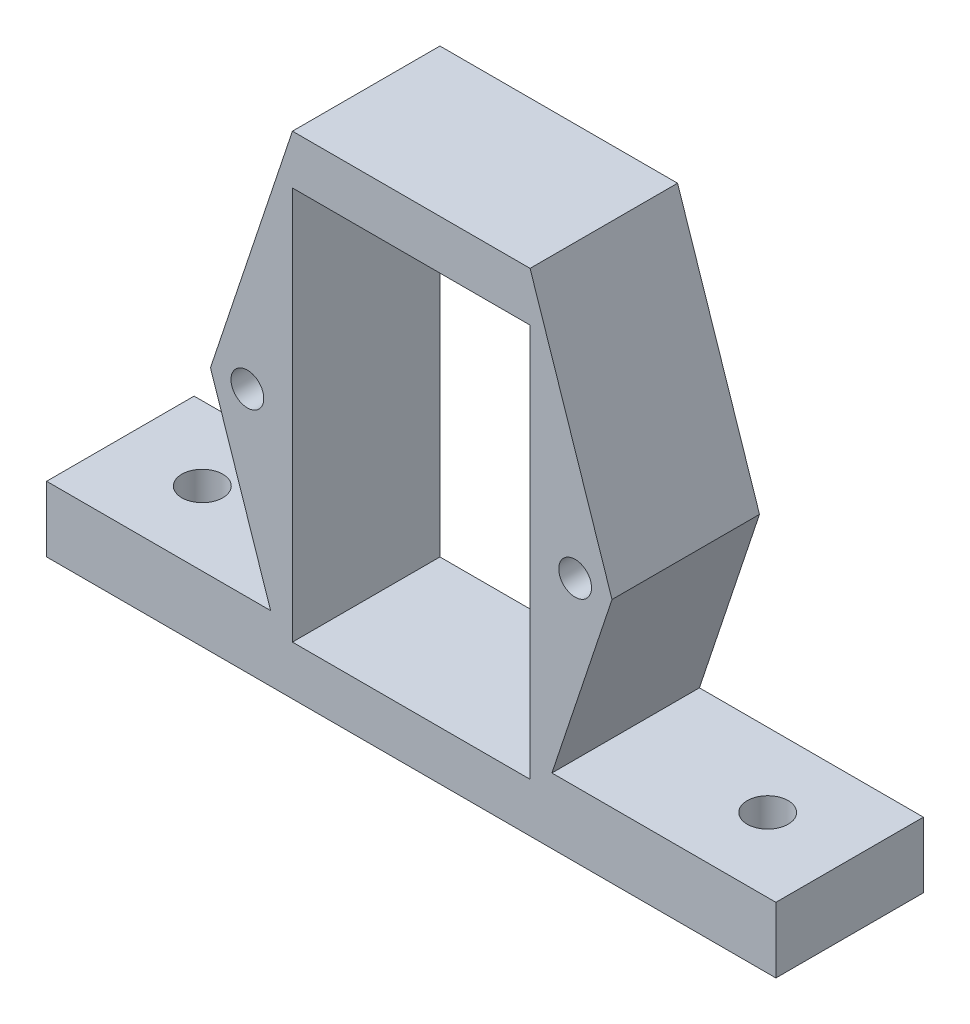
ISO-10303-21;
HEADER;
FILE_DESCRIPTION(('STEP AP214'),'2;1');
FILE_NAME('part.step','',(''),(''),'','','');
FILE_SCHEMA(('AUTOMOTIVE_DESIGN { 1 0 10303 214 1 1 1 1 }'));
ENDSEC;
DATA;
#1=APPLICATION_CONTEXT('core data for automotive mechanical design processes');
#2=APPLICATION_PROTOCOL_DEFINITION('international standard','automotive_design',2000,#1);
#3=PRODUCT_CONTEXT('',#1,'mechanical');
#4=PRODUCT('Part','Part','',(#3));
#5=PRODUCT_RELATED_PRODUCT_CATEGORY('part','',(#4));
#6=PRODUCT_DEFINITION_FORMATION('','',#4);
#7=PRODUCT_DEFINITION_CONTEXT('part definition',#1,'design');
#8=PRODUCT_DEFINITION('design','',#6,#7);
#9=PRODUCT_DEFINITION_SHAPE('','',#8);
#10=(LENGTH_UNIT() NAMED_UNIT(*) SI_UNIT(.MILLI.,.METRE.));
#11=(NAMED_UNIT(*) PLANE_ANGLE_UNIT() SI_UNIT($,.RADIAN.));
#12=(NAMED_UNIT(*) SI_UNIT($,.STERADIAN.) SOLID_ANGLE_UNIT());
#13=UNCERTAINTY_MEASURE_WITH_UNIT(LENGTH_MEASURE(1.E-05),#10,'distance_accuracy_value','');
#14=(GEOMETRIC_REPRESENTATION_CONTEXT(3) GLOBAL_UNCERTAINTY_ASSIGNED_CONTEXT((#13)) GLOBAL_UNIT_ASSIGNED_CONTEXT((#10,
#11,#12)) REPRESENTATION_CONTEXT('',''));
#15=CARTESIAN_POINT('',(0.,0.,0.));
#16=DIRECTION('',(0.,0.,1.));
#17=DIRECTION('',(1.,0.,0.));
#18=AXIS2_PLACEMENT_3D('',#15,#16,#17);
#19=CARTESIAN_POINT('',(11.8345360824742,-3.94484536082475,18.));
#20=DIRECTION('',(0.948683298050514,-0.316227766016838,0.));
#21=DIRECTION('',(0.316227766016838,0.948683298050514,0.));
#22=AXIS2_PLACEMENT_3D('',#19,#20,#21);
#23=PLANE('',#22);
#24=DIRECTION('',(-0.316227766016838,-0.948683298050514,0.));
#25=VECTOR('',#24,1.);
#26=CARTESIAN_POINT('',(11.8345360824742,-3.94484536082475,0.));
#27=LINE('',#26,#25);
#28=CARTESIAN_POINT('',(12.3024054982818,-2.54123711340202,0.));
#29=VERTEX_POINT('',#28);
#30=CARTESIAN_POINT('',(4.96907216494847,-24.5412371134021,0.));
#31=VERTEX_POINT('',#30);
#32=EDGE_CURVE('E189',#29,#31,#27,.T.);
#33=ORIENTED_EDGE('',*,*,#32,.F.);
#34=DIRECTION('',(0.,0.,-1.));
#35=VECTOR('',#34,1.);
#36=CARTESIAN_POINT('',(12.3024054982818,-2.54123711340202,18.));
#37=LINE('',#36,#35);
#38=CARTESIAN_POINT('',(12.3024054982818,-2.54123711340202,18.));
#39=VERTEX_POINT('',#38);
#40=EDGE_CURVE('E11',#39,#29,#37,.T.);
#41=ORIENTED_EDGE('',*,*,#40,.F.);
#42=DIRECTION('',(-0.316227766016838,-0.948683298050514,0.));
#43=VECTOR('',#42,1.);
#44=CARTESIAN_POINT('',(11.8345360824742,-3.94484536082475,18.));
#45=LINE('',#44,#43);
#46=CARTESIAN_POINT('',(4.96907216494847,-24.5412371134021,18.));
#47=VERTEX_POINT('',#46);
#48=EDGE_CURVE('E267',#39,#47,#45,.T.);
#49=ORIENTED_EDGE('',*,*,#48,.T.);
#50=DIRECTION('',(0.,0.,-1.));
#51=VECTOR('',#50,1.);
#52=CARTESIAN_POINT('',(4.96907216494847,-24.5412371134021,18.));
#53=LINE('',#52,#51);
#54=EDGE_CURVE('E104',#47,#31,#53,.T.);
#55=ORIENTED_EDGE('',*,*,#54,.T.);
#56=EDGE_LOOP('',(#33,#41,#49,#55));
#57=FACE_BOUND('',#56,.T.);
#58=ADVANCED_FACE('F33',(#57),#23,.T.);
#59=CARTESIAN_POINT('',(10.309793814433,3.43659793814435,18.));
#60=DIRECTION('',(0.948683298050514,0.316227766016839,0.));
#61=DIRECTION('',(-0.316227766016839,0.948683298050514,0.));
#62=AXIS2_PLACEMENT_3D('',#59,#60,#61);
#63=PLANE('',#62);
#64=DIRECTION('',(0.316227766016839,-0.948683298050514,0.));
#65=VECTOR('',#64,1.);
#66=CARTESIAN_POINT('',(10.309793814433,3.43659793814435,0.));
#67=LINE('',#66,#65);
#68=CARTESIAN_POINT('',(2.30240549828178,27.458762886598,0.));
#69=VERTEX_POINT('',#68);
#70=EDGE_CURVE('E192',#69,#29,#67,.T.);
#71=ORIENTED_EDGE('',*,*,#70,.F.);
#72=DIRECTION('',(0.,0.,-1.));
#73=VECTOR('',#72,1.);
#74=CARTESIAN_POINT('',(2.30240549828178,27.458762886598,18.));
#75=LINE('',#74,#73);
#76=CARTESIAN_POINT('',(2.30240549828178,27.458762886598,18.));
#77=VERTEX_POINT('',#76);
#78=EDGE_CURVE('E43',#77,#69,#75,.T.);
#79=ORIENTED_EDGE('',*,*,#78,.F.);
#80=DIRECTION('',(0.316227766016839,-0.948683298050514,0.));
#81=VECTOR('',#80,1.);
#82=CARTESIAN_POINT('',(10.309793814433,3.43659793814435,18.));
#83=LINE('',#82,#81);
#84=EDGE_CURVE('E269',#77,#39,#83,.T.);
#85=ORIENTED_EDGE('',*,*,#84,.T.);
#86=ORIENTED_EDGE('',*,*,#40,.T.);
#87=EDGE_LOOP('',(#71,#79,#85,#86));
#88=FACE_BOUND('',#87,.T.);
#89=ADVANCED_FACE('F307',(#88),#63,.T.);
#90=CARTESIAN_POINT('',(0.,27.458762886598,18.));
#91=DIRECTION('',(0.,1.,0.));
#92=DIRECTION('',(-1.,0.,0.));
#93=AXIS2_PLACEMENT_3D('',#90,#91,#92);
#94=PLANE('',#93);
#95=DIRECTION('',(1.,0.,0.));
#96=VECTOR('',#95,1.);
#97=CARTESIAN_POINT('',(0.,27.458762886598,0.));
#98=LINE('',#97,#96);
#99=CARTESIAN_POINT('',(-26.6975945017182,27.4587628865979,0.));
#100=VERTEX_POINT('',#99);
#101=EDGE_CURVE('E195',#100,#69,#98,.T.);
#102=ORIENTED_EDGE('',*,*,#101,.F.);
#103=DIRECTION('',(0.,0.,-1.));
#104=VECTOR('',#103,1.);
#105=CARTESIAN_POINT('',(-26.6975945017182,27.4587628865979,18.));
#106=LINE('',#105,#104);
#107=CARTESIAN_POINT('',(-26.6975945017182,27.4587628865979,18.));
#108=VERTEX_POINT('',#107);
#109=EDGE_CURVE('E226',#108,#100,#106,.T.);
#110=ORIENTED_EDGE('',*,*,#109,.F.);
#111=DIRECTION('',(1.,0.,0.));
#112=VECTOR('',#111,1.);
#113=CARTESIAN_POINT('',(0.,27.458762886598,18.));
#114=LINE('',#113,#112);
#115=EDGE_CURVE('E272',#108,#77,#114,.T.);
#116=ORIENTED_EDGE('',*,*,#115,.T.);
#117=ORIENTED_EDGE('',*,*,#78,.T.);
#118=EDGE_LOOP('',(#102,#110,#116,#117));
#119=FACE_BOUND('',#118,.T.);
#120=ADVANCED_FACE('F312',(#119),#94,.T.);
#121=CARTESIAN_POINT('',(-32.2654639175258,10.7551546391753,18.));
#122=DIRECTION('',(0.948683298050514,-0.316227766016838,0.));
#123=DIRECTION('',(0.316227766016838,0.948683298050514,0.));
#124=AXIS2_PLACEMENT_3D('',#121,#122,#123);
#125=PLANE('',#124);
#126=DIRECTION('',(-0.316227766016838,-0.948683298050514,0.));
#127=VECTOR('',#126,1.);
#128=CARTESIAN_POINT('',(-32.2654639175258,10.7551546391753,0.));
#129=LINE('',#128,#127);
#130=CARTESIAN_POINT('',(-36.6975945017182,-2.5412371134021,0.));
#131=VERTEX_POINT('',#130);
#132=EDGE_CURVE('E198',#100,#131,#129,.T.);
#133=ORIENTED_EDGE('',*,*,#132,.T.);
#134=DIRECTION('',(0.,0.,-1.));
#135=VECTOR('',#134,1.);
#136=CARTESIAN_POINT('',(-36.6975945017182,-2.5412371134021,18.));
#137=LINE('',#136,#135);
#138=CARTESIAN_POINT('',(-36.6975945017182,-2.5412371134021,18.));
#139=VERTEX_POINT('',#138);
#140=EDGE_CURVE('E223',#139,#131,#137,.T.);
#141=ORIENTED_EDGE('',*,*,#140,.F.);
#142=DIRECTION('',(-0.316227766016838,-0.948683298050514,0.));
#143=VECTOR('',#142,1.);
#144=CARTESIAN_POINT('',(-32.2654639175258,10.7551546391753,18.));
#145=LINE('',#144,#143);
#146=EDGE_CURVE('E275',#108,#139,#145,.T.);
#147=ORIENTED_EDGE('',*,*,#146,.F.);
#148=ORIENTED_EDGE('',*,*,#109,.T.);
#149=EDGE_LOOP('',(#133,#141,#147,#148));
#150=FACE_BOUND('',#149,.T.);
#151=ADVANCED_FACE('F485',(#150),#125,.F.);
#152=CARTESIAN_POINT('',(-33.790206185567,-11.2634020618557,18.));
#153=DIRECTION('',(0.948683298050514,0.316227766016838,0.));
#154=DIRECTION('',(-0.316227766016838,0.948683298050514,0.));
#155=AXIS2_PLACEMENT_3D('',#152,#153,#154);
#156=PLANE('',#155);
#157=DIRECTION('',(0.316227766016838,-0.948683298050514,0.));
#158=VECTOR('',#157,1.);
#159=CARTESIAN_POINT('',(-33.790206185567,-11.2634020618557,0.));
#160=LINE('',#159,#158);
#161=CARTESIAN_POINT('',(-29.3642611683849,-24.5412371134021,0.));
#162=VERTEX_POINT('',#161);
#163=EDGE_CURVE('E201',#131,#162,#160,.T.);
#164=ORIENTED_EDGE('',*,*,#163,.T.);
#165=DIRECTION('',(0.,0.,-1.));
#166=VECTOR('',#165,1.);
#167=CARTESIAN_POINT('',(-29.3642611683849,-24.5412371134021,18.));
#168=LINE('',#167,#166);
#169=CARTESIAN_POINT('',(-29.3642611683849,-24.5412371134021,18.));
#170=VERTEX_POINT('',#169);
#171=EDGE_CURVE('E221',#170,#162,#168,.T.);
#172=ORIENTED_EDGE('',*,*,#171,.F.);
#173=DIRECTION('',(0.316227766016838,-0.948683298050514,0.));
#174=VECTOR('',#173,1.);
#175=CARTESIAN_POINT('',(-33.790206185567,-11.2634020618557,18.));
#176=LINE('',#175,#174);
#177=EDGE_CURVE('E278',#139,#170,#176,.T.);
#178=ORIENTED_EDGE('',*,*,#177,.F.);
#179=ORIENTED_EDGE('',*,*,#140,.T.);
#180=EDGE_LOOP('',(#164,#172,#178,#179));
#181=FACE_BOUND('',#180,.T.);
#182=ADVANCED_FACE('F290',(#181),#156,.F.);
#183=CARTESIAN_POINT('',(0.,-24.5412371134021,18.));
#184=DIRECTION('',(0.,1.,0.));
#185=DIRECTION('',(0.,0.,1.));
#186=AXIS2_PLACEMENT_3D('',#183,#184,#185);
#187=PLANE('',#186);
#188=CARTESIAN_POINT('',(-46.6975945017182,-24.5412371134021,9.));
#189=DIRECTION('',(0.,1.,0.));
#190=DIRECTION('',(0.,0.,1.));
#191=AXIS2_PLACEMENT_3D('',#188,#189,#190);
#192=CIRCLE('',#191,2.5);
#193=CARTESIAN_POINT('',(-46.6975945017182,-24.5412371134021,11.5));
#194=VERTEX_POINT('',#193);
#195=EDGE_CURVE('E356',#194,#194,#192,.T.);
#196=ORIENTED_EDGE('',*,*,#195,.F.);
#197=EDGE_LOOP('',(#196));
#198=FACE_BOUND('',#197,.T.);
#199=DIRECTION('',(1.,0.,0.));
#200=VECTOR('',#199,1.);
#201=CARTESIAN_POINT('',(0.,-24.5412371134021,0.));
#202=LINE('',#201,#200);
#203=CARTESIAN_POINT('',(-56.6975945017182,-24.5412371134021,0.));
#204=VERTEX_POINT('',#203);
#205=EDGE_CURVE('E204',#204,#162,#202,.T.);
#206=ORIENTED_EDGE('',*,*,#205,.F.);
#207=DIRECTION('',(0.,0.,-1.));
#208=VECTOR('',#207,1.);
#209=CARTESIAN_POINT('',(-56.6975945017182,-24.5412371134021,18.));
#210=LINE('',#209,#208);
#211=CARTESIAN_POINT('',(-56.6975945017182,-24.5412371134021,18.));
#212=VERTEX_POINT('',#211);
#213=EDGE_CURVE('E219',#212,#204,#210,.T.);
#214=ORIENTED_EDGE('',*,*,#213,.F.);
#215=DIRECTION('',(1.,0.,0.));
#216=VECTOR('',#215,1.);
#217=CARTESIAN_POINT('',(0.,-24.5412371134021,18.));
#218=LINE('',#217,#216);
#219=EDGE_CURVE('E280',#212,#170,#218,.T.);
#220=ORIENTED_EDGE('',*,*,#219,.T.);
#221=ORIENTED_EDGE('',*,*,#171,.T.);
#222=EDGE_LOOP('',(#206,#214,#220,#221));
#223=FACE_BOUND('',#222,.T.);
#224=ADVANCED_FACE('F284',(#198,#223),#187,.T.);
#225=CARTESIAN_POINT('',(-56.6975945017182,0.,18.));
#226=DIRECTION('',(1.,0.,0.));
#227=DIRECTION('',(0.,0.,-1.));
#228=AXIS2_PLACEMENT_3D('',#225,#226,#227);
#229=PLANE('',#228);
#230=DIRECTION('',(0.,-1.,0.));
#231=VECTOR('',#230,1.);
#232=CARTESIAN_POINT('',(-56.6975945017182,0.,0.));
#233=LINE('',#232,#231);
#234=CARTESIAN_POINT('',(-56.6975945017182,-32.5412371134021,0.));
#235=VERTEX_POINT('',#234);
#236=EDGE_CURVE('E207',#204,#235,#233,.T.);
#237=ORIENTED_EDGE('',*,*,#236,.T.);
#238=DIRECTION('',(0.,0.,-1.));
#239=VECTOR('',#238,1.);
#240=CARTESIAN_POINT('',(-56.6975945017182,-32.5412371134021,18.));
#241=LINE('',#240,#239);
#242=CARTESIAN_POINT('',(-56.6975945017182,-32.5412371134021,18.));
#243=VERTEX_POINT('',#242);
#244=EDGE_CURVE('E163',#243,#235,#241,.T.);
#245=ORIENTED_EDGE('',*,*,#244,.F.);
#246=DIRECTION('',(0.,-1.,0.));
#247=VECTOR('',#246,1.);
#248=CARTESIAN_POINT('',(-56.6975945017182,0.,18.));
#249=LINE('',#248,#247);
#250=EDGE_CURVE('E151',#212,#243,#249,.T.);
#251=ORIENTED_EDGE('',*,*,#250,.F.);
#252=ORIENTED_EDGE('',*,*,#213,.T.);
#253=EDGE_LOOP('',(#237,#245,#251,#252));
#254=FACE_BOUND('',#253,.T.);
#255=ADVANCED_FACE('F295',(#254),#229,.F.);
#256=CARTESIAN_POINT('',(0.,-32.5412371134021,18.));
#257=DIRECTION('',(0.,1.,0.));
#258=DIRECTION('',(0.,0.,1.));
#259=AXIS2_PLACEMENT_3D('',#256,#257,#258);
#260=PLANE('',#259);
#261=CARTESIAN_POINT('',(-46.6975945017182,-32.5412371134021,9.));
#262=DIRECTION('',(0.,1.,0.));
#263=DIRECTION('',(0.,0.,1.));
#264=AXIS2_PLACEMENT_3D('',#261,#262,#263);
#265=CIRCLE('',#264,2.5);
#266=CARTESIAN_POINT('',(-46.6975945017182,-32.5412371134021,11.5));
#267=VERTEX_POINT('',#266);
#268=EDGE_CURVE('E37',#267,#267,#265,.T.);
#269=ORIENTED_EDGE('',*,*,#268,.T.);
#270=EDGE_LOOP('',(#269));
#271=FACE_BOUND('',#270,.T.);
#272=CARTESIAN_POINT('',(22.3024054982818,-32.5412371134021,9.00000000000001));
#273=DIRECTION('',(0.,1.,0.));
#274=DIRECTION('',(0.,0.,1.));
#275=AXIS2_PLACEMENT_3D('',#272,#273,#274);
#276=CIRCLE('',#275,2.5);
#277=CARTESIAN_POINT('',(22.3024054982818,-32.5412371134021,11.5));
#278=VERTEX_POINT('',#277);
#279=EDGE_CURVE('E359',#278,#278,#276,.T.);
#280=ORIENTED_EDGE('',*,*,#279,.T.);
#281=EDGE_LOOP('',(#280));
#282=FACE_BOUND('',#281,.T.);
#283=DIRECTION('',(1.,0.,0.));
#284=VECTOR('',#283,1.);
#285=CARTESIAN_POINT('',(0.,-32.5412371134021,0.));
#286=LINE('',#285,#284);
#287=CARTESIAN_POINT('',(32.3024054982818,-32.5412371134021,0.));
#288=VERTEX_POINT('',#287);
#289=EDGE_CURVE('E159',#235,#288,#286,.T.);
#290=ORIENTED_EDGE('',*,*,#289,.T.);
#291=DIRECTION('',(0.,0.,-1.));
#292=VECTOR('',#291,1.);
#293=CARTESIAN_POINT('',(32.3024054982818,-32.5412371134021,18.));
#294=LINE('',#293,#292);
#295=CARTESIAN_POINT('',(32.3024054982818,-32.5412371134021,18.));
#296=VERTEX_POINT('',#295);
#297=EDGE_CURVE('E157',#296,#288,#294,.T.);
#298=ORIENTED_EDGE('',*,*,#297,.F.);
#299=DIRECTION('',(1.,0.,0.));
#300=VECTOR('',#299,1.);
#301=CARTESIAN_POINT('',(0.,-32.5412371134021,18.));
#302=LINE('',#301,#300);
#303=EDGE_CURVE('E144',#243,#296,#302,.T.);
#304=ORIENTED_EDGE('',*,*,#303,.F.);
#305=ORIENTED_EDGE('',*,*,#244,.T.);
#306=EDGE_LOOP('',(#290,#298,#304,#305));
#307=FACE_BOUND('',#306,.T.);
#308=ADVANCED_FACE('F158',(#271,#282,#307),#260,.F.);
#309=CARTESIAN_POINT('',(32.3024054982818,0.,18.));
#310=DIRECTION('',(1.,0.,0.));
#311=DIRECTION('',(0.,0.,-1.));
#312=AXIS2_PLACEMENT_3D('',#309,#310,#311);
#313=PLANE('',#312);
#314=DIRECTION('',(0.,-1.,0.));
#315=VECTOR('',#314,1.);
#316=CARTESIAN_POINT('',(32.3024054982818,0.,0.));
#317=LINE('',#316,#315);
#318=CARTESIAN_POINT('',(32.3024054982818,-24.541237113402,0.));
#319=VERTEX_POINT('',#318);
#320=EDGE_CURVE('E211',#319,#288,#317,.T.);
#321=ORIENTED_EDGE('',*,*,#320,.F.);
#322=DIRECTION('',(0.,0.,-1.));
#323=VECTOR('',#322,1.);
#324=CARTESIAN_POINT('',(32.3024054982818,-24.541237113402,18.));
#325=LINE('',#324,#323);
#326=CARTESIAN_POINT('',(32.3024054982818,-24.541237113402,18.));
#327=VERTEX_POINT('',#326);
#328=EDGE_CURVE('E97',#327,#319,#325,.T.);
#329=ORIENTED_EDGE('',*,*,#328,.F.);
#330=DIRECTION('',(0.,-1.,0.));
#331=VECTOR('',#330,1.);
#332=CARTESIAN_POINT('',(32.3024054982818,0.,18.));
#333=LINE('',#332,#331);
#334=EDGE_CURVE('E148',#327,#296,#333,.T.);
#335=ORIENTED_EDGE('',*,*,#334,.T.);
#336=ORIENTED_EDGE('',*,*,#297,.T.);
#337=EDGE_LOOP('',(#321,#329,#335,#336));
#338=FACE_BOUND('',#337,.T.);
#339=ADVANCED_FACE('F165',(#338),#313,.T.);
#340=CARTESIAN_POINT('',(-26.6975945017182,0.,18.));
#341=DIRECTION('',(1.,0.,0.));
#342=DIRECTION('',(0.,1.,0.));
#343=AXIS2_PLACEMENT_3D('',#340,#341,#342);
#344=PLANE('',#343);
#345=DIRECTION('',(0.,-1.,0.));
#346=VECTOR('',#345,1.);
#347=CARTESIAN_POINT('',(-26.6975945017182,0.,0.));
#348=LINE('',#347,#346);
#349=CARTESIAN_POINT('',(-26.6975945017182,21.4587628865979,0.));
#350=VERTEX_POINT('',#349);
#351=CARTESIAN_POINT('',(-26.6975945017182,-26.5412371134021,0.));
#352=VERTEX_POINT('',#351);
#353=EDGE_CURVE('E174',#350,#352,#348,.T.);
#354=ORIENTED_EDGE('',*,*,#353,.F.);
#355=DIRECTION('',(0.,0.,-1.));
#356=VECTOR('',#355,1.);
#357=CARTESIAN_POINT('',(-26.6975945017182,21.4587628865979,18.));
#358=LINE('',#357,#356);
#359=CARTESIAN_POINT('',(-26.6975945017182,21.4587628865979,18.));
#360=VERTEX_POINT('',#359);
#361=EDGE_CURVE('E111',#360,#350,#358,.T.);
#362=ORIENTED_EDGE('',*,*,#361,.F.);
#363=DIRECTION('',(0.,-1.,0.));
#364=VECTOR('',#363,1.);
#365=CARTESIAN_POINT('',(-26.6975945017182,0.,18.));
#366=LINE('',#365,#364);
#367=CARTESIAN_POINT('',(-26.6975945017182,-26.5412371134021,18.));
#368=VERTEX_POINT('',#367);
#369=EDGE_CURVE('E246',#360,#368,#366,.T.);
#370=ORIENTED_EDGE('',*,*,#369,.T.);
#371=DIRECTION('',(0.,0.,-1.));
#372=VECTOR('',#371,1.);
#373=CARTESIAN_POINT('',(-26.6975945017182,-26.5412371134021,18.));
#374=LINE('',#373,#372);
#375=EDGE_CURVE('E167',#368,#352,#374,.T.);
#376=ORIENTED_EDGE('',*,*,#375,.T.);
#377=EDGE_LOOP('',(#354,#362,#370,#376));
#378=FACE_BOUND('',#377,.T.);
#379=ADVANCED_FACE('F245',(#378),#344,.T.);
#380=CARTESIAN_POINT('',(0.,21.4587628865979,18.));
#381=DIRECTION('',(0.,1.,0.));
#382=DIRECTION('',(0.,0.,1.));
#383=AXIS2_PLACEMENT_3D('',#380,#381,#382);
#384=PLANE('',#383);
#385=DIRECTION('',(1.,0.,0.));
#386=VECTOR('',#385,1.);
#387=CARTESIAN_POINT('',(0.,21.4587628865979,0.));
#388=LINE('',#387,#386);
#389=CARTESIAN_POINT('',(2.30240549828178,21.4587628865979,0.));
#390=VERTEX_POINT('',#389);
#391=EDGE_CURVE('E177',#350,#390,#388,.T.);
#392=ORIENTED_EDGE('',*,*,#391,.T.);
#393=DIRECTION('',(0.,0.,-1.));
#394=VECTOR('',#393,1.);
#395=CARTESIAN_POINT('',(2.30240549828178,21.4587628865979,18.));
#396=LINE('',#395,#394);
#397=CARTESIAN_POINT('',(2.30240549828178,21.4587628865979,18.));
#398=VERTEX_POINT('',#397);
#399=EDGE_CURVE('E232',#398,#390,#396,.T.);
#400=ORIENTED_EDGE('',*,*,#399,.F.);
#401=DIRECTION('',(1.,0.,0.));
#402=VECTOR('',#401,1.);
#403=CARTESIAN_POINT('',(0.,21.4587628865979,18.));
#404=LINE('',#403,#402);
#405=EDGE_CURVE('E239',#360,#398,#404,.T.);
#406=ORIENTED_EDGE('',*,*,#405,.F.);
#407=ORIENTED_EDGE('',*,*,#361,.T.);
#408=EDGE_LOOP('',(#392,#400,#406,#407));
#409=FACE_BOUND('',#408,.T.);
#410=ADVANCED_FACE('F236',(#409),#384,.F.);
#411=CARTESIAN_POINT('',(2.30240549828178,0.,18.));
#412=DIRECTION('',(1.,0.,0.));
#413=DIRECTION('',(0.,1.,0.));
#414=AXIS2_PLACEMENT_3D('',#411,#412,#413);
#415=PLANE('',#414);
#416=DIRECTION('',(0.,-1.,0.));
#417=VECTOR('',#416,1.);
#418=CARTESIAN_POINT('',(2.30240549828178,0.,0.));
#419=LINE('',#418,#417);
#420=CARTESIAN_POINT('',(2.30240549828179,-26.5412371134021,0.));
#421=VERTEX_POINT('',#420);
#422=EDGE_CURVE('E180',#390,#421,#419,.T.);
#423=ORIENTED_EDGE('',*,*,#422,.T.);
#424=DIRECTION('',(0.,0.,-1.));
#425=VECTOR('',#424,1.);
#426=CARTESIAN_POINT('',(2.30240549828179,-26.5412371134021,18.));
#427=LINE('',#426,#425);
#428=CARTESIAN_POINT('',(2.30240549828179,-26.5412371134021,18.));
#429=VERTEX_POINT('',#428);
#430=EDGE_CURVE('E230',#429,#421,#427,.T.);
#431=ORIENTED_EDGE('',*,*,#430,.F.);
#432=DIRECTION('',(0.,-1.,0.));
#433=VECTOR('',#432,1.);
#434=CARTESIAN_POINT('',(2.30240549828178,0.,18.));
#435=LINE('',#434,#433);
#436=EDGE_CURVE('E255',#398,#429,#435,.T.);
#437=ORIENTED_EDGE('',*,*,#436,.F.);
#438=ORIENTED_EDGE('',*,*,#399,.T.);
#439=EDGE_LOOP('',(#423,#431,#437,#438));
#440=FACE_BOUND('',#439,.T.);
#441=ADVANCED_FACE('F254',(#440),#415,.F.);
#442=CARTESIAN_POINT('',(-32.1975945017182,-2.54123711340206,18.));
#443=DIRECTION('',(0.,0.,-1.));
#444=DIRECTION('',(-1.,0.,0.));
#445=AXIS2_PLACEMENT_3D('',#442,#443,#444);
#446=CYLINDRICAL_SURFACE('',#445,2.);
#447=CARTESIAN_POINT('',(-32.1975945017182,-2.54123711340206,18.));
#448=DIRECTION('',(0.,0.,1.));
#449=DIRECTION('',(1.,0.,0.));
#450=AXIS2_PLACEMENT_3D('',#447,#448,#449);
#451=CIRCLE('',#450,2.);
#452=CARTESIAN_POINT('',(-30.1975945017182,-2.54123711340206,18.));
#453=VERTEX_POINT('',#452);
#454=EDGE_CURVE('E264',#453,#453,#451,.T.);
#455=ORIENTED_EDGE('',*,*,#454,.T.);
#456=EDGE_LOOP('',(#455));
#457=FACE_BOUND('',#456,.T.);
#458=CARTESIAN_POINT('',(-32.1975945017182,-2.54123711340206,0.));
#459=DIRECTION('',(0.,0.,1.));
#460=DIRECTION('',(1.,0.,0.));
#461=AXIS2_PLACEMENT_3D('',#458,#459,#460);
#462=CIRCLE('',#461,2.);
#463=CARTESIAN_POINT('',(-30.1975945017182,-2.54123711340206,0.));
#464=VERTEX_POINT('',#463);
#465=EDGE_CURVE('E186',#464,#464,#462,.T.);
#466=ORIENTED_EDGE('',*,*,#465,.F.);
#467=EDGE_LOOP('',(#466));
#468=FACE_BOUND('',#467,.T.);
#469=ADVANCED_FACE('F317',(#457,#468),#446,.F.);
#470=CARTESIAN_POINT('',(0.,-26.5412371134021,18.));
#471=DIRECTION('',(0.,1.,0.));
#472=DIRECTION('',(0.,0.,1.));
#473=AXIS2_PLACEMENT_3D('',#470,#471,#472);
#474=PLANE('',#473);
#475=DIRECTION('',(1.,0.,0.));
#476=VECTOR('',#475,1.);
#477=CARTESIAN_POINT('',(0.,-26.5412371134021,0.));
#478=LINE('',#477,#476);
#479=EDGE_CURVE('E183',#352,#421,#478,.T.);
#480=ORIENTED_EDGE('',*,*,#479,.F.);
#481=ORIENTED_EDGE('',*,*,#375,.F.);
#482=DIRECTION('',(1.,0.,0.));
#483=VECTOR('',#482,1.);
#484=CARTESIAN_POINT('',(0.,-26.5412371134021,18.));
#485=LINE('',#484,#483);
#486=EDGE_CURVE('E251',#368,#429,#485,.T.);
#487=ORIENTED_EDGE('',*,*,#486,.T.);
#488=ORIENTED_EDGE('',*,*,#430,.T.);
#489=EDGE_LOOP('',(#480,#481,#487,#488));
#490=FACE_BOUND('',#489,.T.);
#491=ADVANCED_FACE('F250',(#490),#474,.T.);
#492=CARTESIAN_POINT('',(7.80240549828178,-2.54123711340205,18.));
#493=DIRECTION('',(0.,0.,-1.));
#494=DIRECTION('',(-1.,0.,0.));
#495=AXIS2_PLACEMENT_3D('',#492,#493,#494);
#496=CYLINDRICAL_SURFACE('',#495,2.);
#497=CARTESIAN_POINT('',(7.80240549828178,-2.54123711340205,18.));
#498=DIRECTION('',(0.,0.,1.));
#499=DIRECTION('',(1.,0.,0.));
#500=AXIS2_PLACEMENT_3D('',#497,#498,#499);
#501=CIRCLE('',#500,2.);
#502=CARTESIAN_POINT('',(9.80240549828178,-2.54123711340205,18.));
#503=VERTEX_POINT('',#502);
#504=EDGE_CURVE('E215',#503,#503,#501,.T.);
#505=ORIENTED_EDGE('',*,*,#504,.T.);
#506=EDGE_LOOP('',(#505));
#507=FACE_BOUND('',#506,.T.);
#508=CARTESIAN_POINT('',(7.80240549828178,-2.54123711340205,0.));
#509=DIRECTION('',(0.,0.,1.));
#510=DIRECTION('',(1.,0.,0.));
#511=AXIS2_PLACEMENT_3D('',#508,#509,#510);
#512=CIRCLE('',#511,2.);
#513=CARTESIAN_POINT('',(9.80240549828178,-2.54123711340205,0.));
#514=VERTEX_POINT('',#513);
#515=EDGE_CURVE('E171',#514,#514,#512,.T.);
#516=ORIENTED_EDGE('',*,*,#515,.F.);
#517=EDGE_LOOP('',(#516));
#518=FACE_BOUND('',#517,.T.);
#519=ADVANCED_FACE('F35',(#507,#518),#496,.F.);
#520=CARTESIAN_POINT('',(0.,-24.5412371134021,18.));
#521=DIRECTION('',(0.,-1.,0.));
#522=DIRECTION('',(1.,0.,0.));
#523=AXIS2_PLACEMENT_3D('',#520,#521,#522);
#524=PLANE('',#523);
#525=CARTESIAN_POINT('',(22.3024054982818,-24.5412371134021,9.00000000000001));
#526=DIRECTION('',(0.,1.,0.));
#527=DIRECTION('',(0.,0.,1.));
#528=AXIS2_PLACEMENT_3D('',#525,#526,#527);
#529=CIRCLE('',#528,2.5);
#530=CARTESIAN_POINT('',(22.3024054982818,-24.5412371134021,11.5));
#531=VERTEX_POINT('',#530);
#532=EDGE_CURVE('E364',#531,#531,#529,.T.);
#533=ORIENTED_EDGE('',*,*,#532,.F.);
#534=EDGE_LOOP('',(#533));
#535=FACE_BOUND('',#534,.T.);
#536=DIRECTION('',(-1.,0.,0.));
#537=VECTOR('',#536,1.);
#538=CARTESIAN_POINT('',(0.,-24.5412371134021,0.));
#539=LINE('',#538,#537);
#540=EDGE_CURVE('E213',#319,#31,#539,.T.);
#541=ORIENTED_EDGE('',*,*,#540,.T.);
#542=ORIENTED_EDGE('',*,*,#54,.F.);
#543=DIRECTION('',(-1.,0.,0.));
#544=VECTOR('',#543,1.);
#545=CARTESIAN_POINT('',(0.,-24.5412371134021,18.));
#546=LINE('',#545,#544);
#547=EDGE_CURVE('E52',#327,#47,#546,.T.);
#548=ORIENTED_EDGE('',*,*,#547,.F.);
#549=ORIENTED_EDGE('',*,*,#328,.T.);
#550=EDGE_LOOP('',(#541,#542,#548,#549));
#551=FACE_BOUND('',#550,.T.);
#552=ADVANCED_FACE('F334',(#535,#551),#524,.F.);
#553=CARTESIAN_POINT('',(0.,0.,18.));
#554=DIRECTION('',(0.,0.,1.));
#555=DIRECTION('',(1.,0.,0.));
#556=AXIS2_PLACEMENT_3D('',#553,#554,#555);
#557=PLANE('',#556);
#558=ORIENTED_EDGE('',*,*,#504,.F.);
#559=EDGE_LOOP('',(#558));
#560=FACE_BOUND('',#559,.T.);
#561=ORIENTED_EDGE('',*,*,#369,.F.);
#562=ORIENTED_EDGE('',*,*,#405,.T.);
#563=ORIENTED_EDGE('',*,*,#436,.T.);
#564=ORIENTED_EDGE('',*,*,#486,.F.);
#565=EDGE_LOOP('',(#561,#562,#563,#564));
#566=FACE_BOUND('',#565,.T.);
#567=ORIENTED_EDGE('',*,*,#454,.F.);
#568=EDGE_LOOP('',(#567));
#569=FACE_BOUND('',#568,.T.);
#570=ORIENTED_EDGE('',*,*,#48,.F.);
#571=ORIENTED_EDGE('',*,*,#84,.F.);
#572=ORIENTED_EDGE('',*,*,#115,.F.);
#573=ORIENTED_EDGE('',*,*,#146,.T.);
#574=ORIENTED_EDGE('',*,*,#177,.T.);
#575=ORIENTED_EDGE('',*,*,#219,.F.);
#576=ORIENTED_EDGE('',*,*,#250,.T.);
#577=ORIENTED_EDGE('',*,*,#303,.T.);
#578=ORIENTED_EDGE('',*,*,#334,.F.);
#579=ORIENTED_EDGE('',*,*,#547,.T.);
#580=EDGE_LOOP('',(#570,#571,#572,#573,#574,#575,#576,#577,#578,#579));
#581=FACE_BOUND('',#580,.T.);
#582=ADVANCED_FACE('F146',(#560,#566,#569,#581),#557,.T.);
#583=CARTESIAN_POINT('',(0.,0.,0.));
#584=DIRECTION('',(0.,0.,1.));
#585=DIRECTION('',(1.,0.,0.));
#586=AXIS2_PLACEMENT_3D('',#583,#584,#585);
#587=PLANE('',#586);
#588=ORIENTED_EDGE('',*,*,#515,.T.);
#589=EDGE_LOOP('',(#588));
#590=FACE_BOUND('',#589,.T.);
#591=ORIENTED_EDGE('',*,*,#353,.T.);
#592=ORIENTED_EDGE('',*,*,#479,.T.);
#593=ORIENTED_EDGE('',*,*,#422,.F.);
#594=ORIENTED_EDGE('',*,*,#391,.F.);
#595=EDGE_LOOP('',(#591,#592,#593,#594));
#596=FACE_BOUND('',#595,.T.);
#597=ORIENTED_EDGE('',*,*,#465,.T.);
#598=EDGE_LOOP('',(#597));
#599=FACE_BOUND('',#598,.T.);
#600=ORIENTED_EDGE('',*,*,#32,.T.);
#601=ORIENTED_EDGE('',*,*,#540,.F.);
#602=ORIENTED_EDGE('',*,*,#320,.T.);
#603=ORIENTED_EDGE('',*,*,#289,.F.);
#604=ORIENTED_EDGE('',*,*,#236,.F.);
#605=ORIENTED_EDGE('',*,*,#205,.T.);
#606=ORIENTED_EDGE('',*,*,#163,.F.);
#607=ORIENTED_EDGE('',*,*,#132,.F.);
#608=ORIENTED_EDGE('',*,*,#101,.T.);
#609=ORIENTED_EDGE('',*,*,#70,.T.);
#610=EDGE_LOOP('',(#600,#601,#602,#603,#604,#605,#606,#607,#608,#609));
#611=FACE_BOUND('',#610,.T.);
#612=ADVANCED_FACE('F242',(#590,#596,#599,#611),#587,.F.);
#613=CARTESIAN_POINT('',(22.3024054982818,-42.541237113402,9.00000000000001));
#614=DIRECTION('',(0.,1.,0.));
#615=DIRECTION('',(0.,0.,1.));
#616=AXIS2_PLACEMENT_3D('',#613,#614,#615);
#617=CYLINDRICAL_SURFACE('',#616,2.5);
#618=ORIENTED_EDGE('',*,*,#532,.T.);
#619=EDGE_LOOP('',(#618));
#620=FACE_BOUND('',#619,.T.);
#621=ORIENTED_EDGE('',*,*,#279,.F.);
#622=EDGE_LOOP('',(#621));
#623=FACE_BOUND('',#622,.T.);
#624=ADVANCED_FACE('F340',(#620,#623),#617,.F.);
#625=CARTESIAN_POINT('',(-46.6975945017182,-42.541237113402,9.));
#626=DIRECTION('',(0.,1.,0.));
#627=DIRECTION('',(0.,0.,1.));
#628=AXIS2_PLACEMENT_3D('',#625,#626,#627);
#629=CYLINDRICAL_SURFACE('',#628,2.5);
#630=ORIENTED_EDGE('',*,*,#195,.T.);
#631=EDGE_LOOP('',(#630));
#632=FACE_BOUND('',#631,.T.);
#633=ORIENTED_EDGE('',*,*,#268,.F.);
#634=EDGE_LOOP('',(#633));
#635=FACE_BOUND('',#634,.T.);
#636=ADVANCED_FACE('F347',(#632,#635),#629,.F.);
#637=CLOSED_SHELL('',(#58,#89,#120,#151,#182,#224,#255,#308,#339,#379,#410,#441,#469,#491,#519,
#552,#582,#612,#624,#636));
#638=MANIFOLD_SOLID_BREP('B2',#637);
#639=ADVANCED_BREP_SHAPE_REPRESENTATION('',(#18,#638),#14);
#640=SHAPE_DEFINITION_REPRESENTATION(#9,#639);
ENDSEC;
END-ISO-10303-21;
